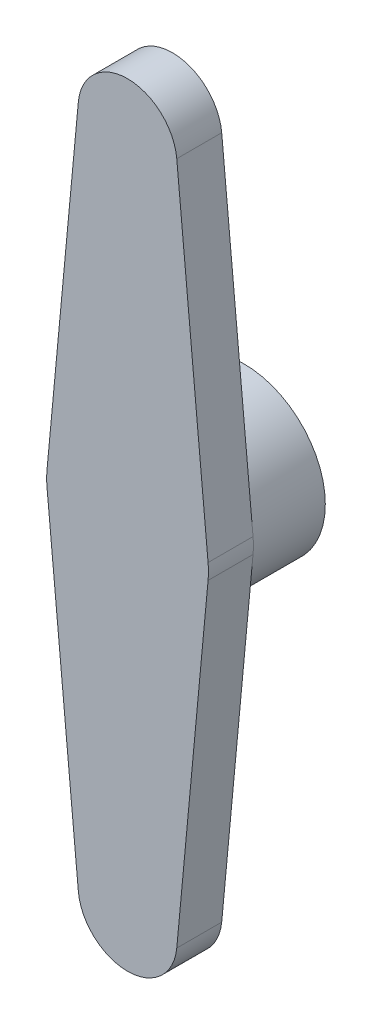
ISO-10303-21;
HEADER;
FILE_DESCRIPTION(('STEP AP214'),'2;1');
FILE_NAME('part.step','',(''),(''),'','','');
FILE_SCHEMA(('AUTOMOTIVE_DESIGN { 1 0 10303 214 1 1 1 1 }'));
ENDSEC;
DATA;
#1=APPLICATION_CONTEXT('core data for automotive mechanical design processes');
#2=APPLICATION_PROTOCOL_DEFINITION('international standard','automotive_design',2000,#1);
#3=PRODUCT_CONTEXT('',#1,'mechanical');
#4=PRODUCT('Part','Part','',(#3));
#5=PRODUCT_RELATED_PRODUCT_CATEGORY('part','',(#4));
#6=PRODUCT_DEFINITION_FORMATION('','',#4);
#7=PRODUCT_DEFINITION_CONTEXT('part definition',#1,'design');
#8=PRODUCT_DEFINITION('design','',#6,#7);
#9=PRODUCT_DEFINITION_SHAPE('','',#8);
#10=(LENGTH_UNIT() NAMED_UNIT(*) SI_UNIT(.MILLI.,.METRE.));
#11=(NAMED_UNIT(*) PLANE_ANGLE_UNIT() SI_UNIT($,.RADIAN.));
#12=(NAMED_UNIT(*) SI_UNIT($,.STERADIAN.) SOLID_ANGLE_UNIT());
#13=UNCERTAINTY_MEASURE_WITH_UNIT(LENGTH_MEASURE(1.E-05),#10,'distance_accuracy_value','');
#14=(GEOMETRIC_REPRESENTATION_CONTEXT(3) GLOBAL_UNCERTAINTY_ASSIGNED_CONTEXT((#13)) GLOBAL_UNIT_ASSIGNED_CONTEXT((#10,
#11,#12)) REPRESENTATION_CONTEXT('',''));
#15=CARTESIAN_POINT('',(0.,0.,0.));
#16=DIRECTION('',(0.,0.,1.));
#17=DIRECTION('',(1.,0.,0.));
#18=AXIS2_PLACEMENT_3D('',#15,#16,#17);
#19=CARTESIAN_POINT('',(0.,0.,9.));
#20=DIRECTION('',(0.,0.,1.));
#21=DIRECTION('',(1.,0.,0.));
#22=AXIS2_PLACEMENT_3D('',#19,#20,#21);
#23=PLANE('',#22);
#24=CARTESIAN_POINT('',(0.,14.999999563202,9.));
#25=DIRECTION('',(0.,0.,1.));
#26=DIRECTION('',(0.995396166005759,0.0958460886058268,0.));
#27=AXIS2_PLACEMENT_3D('',#24,#25,#26);
#28=CIRCLE('',#27,2.200000436798);
#29=CARTESIAN_POINT('',(2.189872,15.210861,9.));
#30=VERTEX_POINT('',#29);
#31=CARTESIAN_POINT('',(-2.189872,15.210861,9.));
#32=VERTEX_POINT('',#31);
#33=EDGE_CURVE('E37',#30,#32,#28,.T.);
#34=ORIENTED_EDGE('',*,*,#33,.F.);
#35=DIRECTION('',(-0.0933329907043877,0.995634949590549,0.));
#36=VECTOR('',#35,1.);
#37=CARTESIAN_POINT('',(3.583426,0.345045,9.));
#38=LINE('',#37,#36);
#39=CARTESIAN_POINT('',(3.583426,0.345045,9.));
#40=VERTEX_POINT('',#39);
#41=EDGE_CURVE('E202',#40,#30,#38,.T.);
#42=ORIENTED_EDGE('',*,*,#41,.F.);
#43=CARTESIAN_POINT('',(0.,0.,9.));
#44=DIRECTION('',(0.,0.,1.));
#45=DIRECTION('',(1.,0.,0.));
#46=AXIS2_PLACEMENT_3D('',#43,#44,#45);
#47=CIRCLE('',#46,3.6);
#48=CARTESIAN_POINT('',(-3.583426,0.345045,9.));
#49=VERTEX_POINT('',#48);
#50=EDGE_CURVE('E200',#40,#49,#47,.T.);
#51=ORIENTED_EDGE('',*,*,#50,.T.);
#52=DIRECTION('',(-0.0933329907043877,-0.995634949590549,0.));
#53=VECTOR('',#52,1.);
#54=CARTESIAN_POINT('',(-2.189872,15.210861,9.));
#55=LINE('',#54,#53);
#56=EDGE_CURVE('E9',#32,#49,#55,.T.);
#57=ORIENTED_EDGE('',*,*,#56,.F.);
#58=EDGE_LOOP('',(#34,#42,#51,#57));
#59=FACE_BOUND('',#58,.T.);
#60=ADVANCED_FACE('F15',(#59),#23,.F.);
#61=CARTESIAN_POINT('',(0.,0.,5.8));
#62=DIRECTION('',(0.,0.,1.));
#63=DIRECTION('',(1.,0.,0.));
#64=AXIS2_PLACEMENT_3D('',#61,#62,#63);
#65=PLANE('',#64);
#66=CARTESIAN_POINT('',(0.,0.,5.8));
#67=DIRECTION('',(0.,0.,1.));
#68=DIRECTION('',(1.,0.,0.));
#69=AXIS2_PLACEMENT_3D('',#66,#67,#68);
#70=CIRCLE('',#69,3.6);
#71=CARTESIAN_POINT('',(3.6,0.,5.8));
#72=VERTEX_POINT('',#71);
#73=EDGE_CURVE('E205',#72,#72,#70,.T.);
#74=ORIENTED_EDGE('',*,*,#73,.F.);
#75=EDGE_LOOP('',(#74));
#76=FACE_BOUND('',#75,.T.);
#77=ADVANCED_FACE('F246',(#76),#65,.F.);
#78=CARTESIAN_POINT('',(-2.189872,15.210861,9.));
#79=DIRECTION('',(0.995634949590549,-0.0933329907043877,0.));
#80=DIRECTION('',(0.,0.,-1.));
#81=AXIS2_PLACEMENT_3D('',#78,#79,#80);
#82=PLANE('',#81);
#83=ORIENTED_EDGE('',*,*,#56,.T.);
#84=DIRECTION('',(0.,0.,1.));
#85=VECTOR('',#84,1.);
#86=CARTESIAN_POINT('',(-3.583426,0.345045,9.));
#87=LINE('',#86,#85);
#88=CARTESIAN_POINT('',(-3.583426,0.345045,11.));
#89=VERTEX_POINT('',#88);
#90=EDGE_CURVE('E181',#49,#89,#87,.T.);
#91=ORIENTED_EDGE('',*,*,#90,.T.);
#92=DIRECTION('',(-0.0933329907043877,-0.995634949590549,0.));
#93=VECTOR('',#92,1.);
#94=CARTESIAN_POINT('',(-2.189872,15.210861,11.));
#95=LINE('',#94,#93);
#96=CARTESIAN_POINT('',(-2.189872,15.210861,11.));
#97=VERTEX_POINT('',#96);
#98=EDGE_CURVE('E144',#97,#89,#95,.T.);
#99=ORIENTED_EDGE('',*,*,#98,.F.);
#100=DIRECTION('',(0.,0.,1.));
#101=VECTOR('',#100,1.);
#102=CARTESIAN_POINT('',(-2.189872,15.210861,9.));
#103=LINE('',#102,#101);
#104=EDGE_CURVE('E23',#32,#97,#103,.T.);
#105=ORIENTED_EDGE('',*,*,#104,.F.);
#106=EDGE_LOOP('',(#83,#91,#99,#105));
#107=FACE_BOUND('',#106,.T.);
#108=ADVANCED_FACE('F222',(#107),#82,.F.);
#109=CARTESIAN_POINT('',(0.,14.999999563202,9.));
#110=DIRECTION('',(0.,0.,-1.));
#111=DIRECTION('',(0.995396166005759,0.0958460886058268,0.));
#112=AXIS2_PLACEMENT_3D('',#109,#110,#111);
#113=CYLINDRICAL_SURFACE('',#112,2.200000436798);
#114=ORIENTED_EDGE('',*,*,#33,.T.);
#115=ORIENTED_EDGE('',*,*,#104,.T.);
#116=CARTESIAN_POINT('',(0.,14.999999563202,11.));
#117=DIRECTION('',(0.,0.,1.));
#118=DIRECTION('',(0.995396166005759,0.0958460886058268,0.));
#119=AXIS2_PLACEMENT_3D('',#116,#117,#118);
#120=CIRCLE('',#119,2.200000436798);
#121=CARTESIAN_POINT('',(2.189872,15.210861,11.));
#122=VERTEX_POINT('',#121);
#123=EDGE_CURVE('E170',#122,#97,#120,.T.);
#124=ORIENTED_EDGE('',*,*,#123,.F.);
#125=DIRECTION('',(0.,0.,1.));
#126=VECTOR('',#125,1.);
#127=CARTESIAN_POINT('',(2.189872,15.210861,9.));
#128=LINE('',#127,#126);
#129=EDGE_CURVE('E207',#30,#122,#128,.T.);
#130=ORIENTED_EDGE('',*,*,#129,.F.);
#131=EDGE_LOOP('',(#114,#115,#124,#130));
#132=FACE_BOUND('',#131,.T.);
#133=ADVANCED_FACE('F217',(#132),#113,.T.);
#134=CARTESIAN_POINT('',(3.583426,0.345045,9.));
#135=DIRECTION('',(-0.995634949590549,-0.0933329907043877,0.));
#136=DIRECTION('',(-0.0933329907043877,0.995634949590549,0.));
#137=AXIS2_PLACEMENT_3D('',#134,#135,#136);
#138=PLANE('',#137);
#139=ORIENTED_EDGE('',*,*,#41,.T.);
#140=ORIENTED_EDGE('',*,*,#129,.T.);
#141=DIRECTION('',(-0.0933329907043877,0.995634949590549,0.));
#142=VECTOR('',#141,1.);
#143=CARTESIAN_POINT('',(3.583426,0.345045,11.));
#144=LINE('',#143,#142);
#145=CARTESIAN_POINT('',(3.583426,0.345045,11.));
#146=VERTEX_POINT('',#145);
#147=EDGE_CURVE('E162',#146,#122,#144,.T.);
#148=ORIENTED_EDGE('',*,*,#147,.F.);
#149=DIRECTION('',(0.,0.,1.));
#150=VECTOR('',#149,1.);
#151=CARTESIAN_POINT('',(3.583426,0.345045,9.));
#152=LINE('',#151,#150);
#153=EDGE_CURVE('E193',#40,#146,#152,.T.);
#154=ORIENTED_EDGE('',*,*,#153,.F.);
#155=EDGE_LOOP('',(#139,#140,#148,#154));
#156=FACE_BOUND('',#155,.T.);
#157=ADVANCED_FACE('F228',(#156),#138,.F.);
#158=CARTESIAN_POINT('',(0.,0.,5.8));
#159=DIRECTION('',(0.,0.,-1.));
#160=DIRECTION('',(1.,0.,0.));
#161=AXIS2_PLACEMENT_3D('',#158,#159,#160);
#162=CYLINDRICAL_SURFACE('',#161,3.6);
#163=DIRECTION('',(0.,0.,1.));
#164=VECTOR('',#163,1.);
#165=CARTESIAN_POINT('',(3.6,0.,5.8));
#166=LINE('',#165,#164);
#167=CARTESIAN_POINT('',(3.6,0.,9.));
#168=VERTEX_POINT('',#167);
#169=EDGE_CURVE('E198',#72,#168,#166,.T.);
#170=ORIENTED_EDGE('',*,*,#169,.T.);
#171=CARTESIAN_POINT('',(6.185890561738E-05,0.,9.));
#172=DIRECTION('',(0.,0.,1.));
#173=DIRECTION('',(0.995396032000994,-0.0958474802833994,0.));
#174=AXIS2_PLACEMENT_3D('',#171,#172,#173);
#175=CIRCLE('',#174,3.599938141094);
#176=CARTESIAN_POINT('',(3.583426,-0.345045,9.));
#177=VERTEX_POINT('',#176);
#178=EDGE_CURVE('E184',#177,#168,#175,.T.);
#179=ORIENTED_EDGE('',*,*,#178,.F.);
#180=CARTESIAN_POINT('',(0.,0.,9.));
#181=DIRECTION('',(0.,0.,1.));
#182=DIRECTION('',(1.,0.,0.));
#183=AXIS2_PLACEMENT_3D('',#180,#181,#182);
#184=CIRCLE('',#183,3.6);
#185=CARTESIAN_POINT('',(-3.583426,-0.345045,9.));
#186=VERTEX_POINT('',#185);
#187=EDGE_CURVE('E151',#186,#177,#184,.T.);
#188=ORIENTED_EDGE('',*,*,#187,.F.);
#189=CARTESIAN_POINT('',(-6.185890561738E-05,0.,9.));
#190=DIRECTION('',(0.,0.,1.));
#191=DIRECTION('',(-0.995396032000994,0.0958474802833994,0.));
#192=AXIS2_PLACEMENT_3D('',#189,#190,#191);
#193=CIRCLE('',#192,3.599938141094);
#194=EDGE_CURVE('E150',#49,#186,#193,.T.);
#195=ORIENTED_EDGE('',*,*,#194,.F.);
#196=ORIENTED_EDGE('',*,*,#50,.F.);
#197=CARTESIAN_POINT('',(6.185890561738E-05,0.,9.));
#198=DIRECTION('',(0.,0.,1.));
#199=DIRECTION('',(0.995396032000994,-0.0958474802833994,0.));
#200=AXIS2_PLACEMENT_3D('',#197,#198,#199);
#201=CIRCLE('',#200,3.599938141094);
#202=EDGE_CURVE('E188',#168,#40,#201,.T.);
#203=ORIENTED_EDGE('',*,*,#202,.F.);
#204=ORIENTED_EDGE('',*,*,#169,.F.);
#205=ORIENTED_EDGE('',*,*,#73,.T.);
#206=EDGE_LOOP('',(#170,#179,#188,#195,#196,#203,#204,#205));
#207=FACE_BOUND('',#206,.T.);
#208=ADVANCED_FACE('F232',(#207),#162,.T.);
#209=CARTESIAN_POINT('',(6.185890561738E-05,0.,9.));
#210=DIRECTION('',(0.,0.,-1.));
#211=DIRECTION('',(0.995396032000994,-0.0958474802833994,0.));
#212=AXIS2_PLACEMENT_3D('',#209,#210,#211);
#213=CYLINDRICAL_SURFACE('',#212,3.599938141094);
#214=ORIENTED_EDGE('',*,*,#178,.T.);
#215=ORIENTED_EDGE('',*,*,#202,.T.);
#216=ORIENTED_EDGE('',*,*,#153,.T.);
#217=CARTESIAN_POINT('',(6.185890561738E-05,0.,11.));
#218=DIRECTION('',(0.,0.,1.));
#219=DIRECTION('',(0.995396032000994,-0.0958474802833994,0.));
#220=AXIS2_PLACEMENT_3D('',#217,#218,#219);
#221=CIRCLE('',#220,3.599938141094);
#222=CARTESIAN_POINT('',(3.583426,-0.345045,11.));
#223=VERTEX_POINT('',#222);
#224=EDGE_CURVE('E152',#223,#146,#221,.T.);
#225=ORIENTED_EDGE('',*,*,#224,.F.);
#226=DIRECTION('',(0.,0.,1.));
#227=VECTOR('',#226,1.);
#228=CARTESIAN_POINT('',(3.583426,-0.345045,9.));
#229=LINE('',#228,#227);
#230=EDGE_CURVE('E159',#177,#223,#229,.T.);
#231=ORIENTED_EDGE('',*,*,#230,.F.);
#232=EDGE_LOOP('',(#214,#215,#216,#225,#231));
#233=FACE_BOUND('',#232,.T.);
#234=ADVANCED_FACE('F242',(#233),#213,.T.);
#235=CARTESIAN_POINT('',(-6.185890561738E-05,0.,9.));
#236=DIRECTION('',(0.,0.,-1.));
#237=DIRECTION('',(-0.995396032000994,0.0958474802833994,0.));
#238=AXIS2_PLACEMENT_3D('',#235,#236,#237);
#239=CYLINDRICAL_SURFACE('',#238,3.599938141094);
#240=ORIENTED_EDGE('',*,*,#194,.T.);
#241=DIRECTION('',(0.,0.,1.));
#242=VECTOR('',#241,1.);
#243=CARTESIAN_POINT('',(-3.583426,-0.345045,9.));
#244=LINE('',#243,#242);
#245=CARTESIAN_POINT('',(-3.583426,-0.345045,11.));
#246=VERTEX_POINT('',#245);
#247=EDGE_CURVE('E113',#186,#246,#244,.T.);
#248=ORIENTED_EDGE('',*,*,#247,.T.);
#249=CARTESIAN_POINT('',(-6.185890561738E-05,0.,11.));
#250=DIRECTION('',(0.,0.,1.));
#251=DIRECTION('',(-0.995396032000994,0.0958474802833994,0.));
#252=AXIS2_PLACEMENT_3D('',#249,#250,#251);
#253=CIRCLE('',#252,3.599938141094);
#254=EDGE_CURVE('E148',#89,#246,#253,.T.);
#255=ORIENTED_EDGE('',*,*,#254,.F.);
#256=ORIENTED_EDGE('',*,*,#90,.F.);
#257=EDGE_LOOP('',(#240,#248,#255,#256));
#258=FACE_BOUND('',#257,.T.);
#259=ADVANCED_FACE('F238',(#258),#239,.T.);
#260=CARTESIAN_POINT('',(0.,0.,11.));
#261=DIRECTION('',(0.,0.,1.));
#262=DIRECTION('',(1.,0.,0.));
#263=AXIS2_PLACEMENT_3D('',#260,#261,#262);
#264=PLANE('',#263);
#265=CARTESIAN_POINT('',(0.,-14.9999995632,11.));
#266=DIRECTION('',(0.,0.,1.));
#267=DIRECTION('',(-0.995396166005759,-0.0958460886058268,0.));
#268=AXIS2_PLACEMENT_3D('',#265,#266,#267);
#269=CIRCLE('',#268,2.200000436798);
#270=CARTESIAN_POINT('',(-2.189872,-15.210861,11.));
#271=VERTEX_POINT('',#270);
#272=CARTESIAN_POINT('',(2.189872,-15.210861,11.));
#273=VERTEX_POINT('',#272);
#274=EDGE_CURVE('E128',#271,#273,#269,.T.);
#275=ORIENTED_EDGE('',*,*,#274,.T.);
#276=DIRECTION('',(0.0933329907043877,0.995634949590549,0.));
#277=VECTOR('',#276,1.);
#278=CARTESIAN_POINT('',(2.189872,-15.210861,11.));
#279=LINE('',#278,#277);
#280=EDGE_CURVE('E154',#273,#223,#279,.T.);
#281=ORIENTED_EDGE('',*,*,#280,.T.);
#282=ORIENTED_EDGE('',*,*,#224,.T.);
#283=ORIENTED_EDGE('',*,*,#147,.T.);
#284=ORIENTED_EDGE('',*,*,#123,.T.);
#285=ORIENTED_EDGE('',*,*,#98,.T.);
#286=ORIENTED_EDGE('',*,*,#254,.T.);
#287=DIRECTION('',(0.0933329907043877,-0.995634949590549,0.));
#288=VECTOR('',#287,1.);
#289=CARTESIAN_POINT('',(-3.583426,-0.345045,11.));
#290=LINE('',#289,#288);
#291=EDGE_CURVE('E120',#246,#271,#290,.T.);
#292=ORIENTED_EDGE('',*,*,#291,.T.);
#293=EDGE_LOOP('',(#275,#281,#282,#283,#284,#285,#286,#292));
#294=FACE_BOUND('',#293,.T.);
#295=ADVANCED_FACE('F223',(#294),#264,.T.);
#296=CARTESIAN_POINT('',(0.,0.,9.));
#297=DIRECTION('',(0.,0.,1.));
#298=DIRECTION('',(1.,0.,0.));
#299=AXIS2_PLACEMENT_3D('',#296,#297,#298);
#300=PLANE('',#299);
#301=ORIENTED_EDGE('',*,*,#187,.T.);
#302=DIRECTION('',(0.0933329907043877,0.995634949590549,0.));
#303=VECTOR('',#302,1.);
#304=CARTESIAN_POINT('',(2.189872,-15.210861,9.));
#305=LINE('',#304,#303);
#306=CARTESIAN_POINT('',(2.189872,-15.210861,9.));
#307=VERTEX_POINT('',#306);
#308=EDGE_CURVE('E132',#307,#177,#305,.T.);
#309=ORIENTED_EDGE('',*,*,#308,.F.);
#310=CARTESIAN_POINT('',(0.,-14.9999995632,9.));
#311=DIRECTION('',(0.,0.,1.));
#312=DIRECTION('',(-0.995396166005759,-0.0958460886058268,0.));
#313=AXIS2_PLACEMENT_3D('',#310,#311,#312);
#314=CIRCLE('',#313,2.200000436798);
#315=CARTESIAN_POINT('',(-2.189872,-15.210861,9.));
#316=VERTEX_POINT('',#315);
#317=EDGE_CURVE('E130',#316,#307,#314,.T.);
#318=ORIENTED_EDGE('',*,*,#317,.F.);
#319=DIRECTION('',(0.0933329907043877,-0.995634949590549,0.));
#320=VECTOR('',#319,1.);
#321=CARTESIAN_POINT('',(-3.583426,-0.345045,9.));
#322=LINE('',#321,#320);
#323=EDGE_CURVE('E107',#186,#316,#322,.T.);
#324=ORIENTED_EDGE('',*,*,#323,.F.);
#325=EDGE_LOOP('',(#301,#309,#318,#324));
#326=FACE_BOUND('',#325,.T.);
#327=ADVANCED_FACE('F131',(#326),#300,.F.);
#328=CARTESIAN_POINT('',(2.189872,-15.210861,9.));
#329=DIRECTION('',(-0.995634949590549,0.0933329907043877,0.));
#330=DIRECTION('',(0.,0.,1.));
#331=AXIS2_PLACEMENT_3D('',#328,#329,#330);
#332=PLANE('',#331);
#333=ORIENTED_EDGE('',*,*,#308,.T.);
#334=ORIENTED_EDGE('',*,*,#230,.T.);
#335=ORIENTED_EDGE('',*,*,#280,.F.);
#336=DIRECTION('',(0.,0.,1.));
#337=VECTOR('',#336,1.);
#338=CARTESIAN_POINT('',(2.189872,-15.210861,9.));
#339=LINE('',#338,#337);
#340=EDGE_CURVE('E136',#307,#273,#339,.T.);
#341=ORIENTED_EDGE('',*,*,#340,.F.);
#342=EDGE_LOOP('',(#333,#334,#335,#341));
#343=FACE_BOUND('',#342,.T.);
#344=ADVANCED_FACE('F239',(#343),#332,.F.);
#345=CARTESIAN_POINT('',(-3.583426,-0.345045,9.));
#346=DIRECTION('',(0.995634949590549,0.0933329907043877,0.));
#347=DIRECTION('',(0.,0.,-1.));
#348=AXIS2_PLACEMENT_3D('',#345,#346,#347);
#349=PLANE('',#348);
#350=ORIENTED_EDGE('',*,*,#323,.T.);
#351=DIRECTION('',(0.,0.,1.));
#352=VECTOR('',#351,1.);
#353=CARTESIAN_POINT('',(-2.189872,-15.210861,9.));
#354=LINE('',#353,#352);
#355=EDGE_CURVE('E115',#316,#271,#354,.T.);
#356=ORIENTED_EDGE('',*,*,#355,.T.);
#357=ORIENTED_EDGE('',*,*,#291,.F.);
#358=ORIENTED_EDGE('',*,*,#247,.F.);
#359=EDGE_LOOP('',(#350,#356,#357,#358));
#360=FACE_BOUND('',#359,.T.);
#361=ADVANCED_FACE('F109',(#360),#349,.F.);
#362=CARTESIAN_POINT('',(0.,-14.9999995632,9.));
#363=DIRECTION('',(0.,0.,-1.));
#364=DIRECTION('',(-0.995396166005759,-0.0958460886058268,0.));
#365=AXIS2_PLACEMENT_3D('',#362,#363,#364);
#366=CYLINDRICAL_SURFACE('',#365,2.200000436798);
#367=ORIENTED_EDGE('',*,*,#317,.T.);
#368=ORIENTED_EDGE('',*,*,#340,.T.);
#369=ORIENTED_EDGE('',*,*,#274,.F.);
#370=ORIENTED_EDGE('',*,*,#355,.F.);
#371=EDGE_LOOP('',(#367,#368,#369,#370));
#372=FACE_BOUND('',#371,.T.);
#373=ADVANCED_FACE('F122',(#372),#366,.T.);
#374=CLOSED_SHELL('',(#60,#77,#108,#133,#157,#208,#234,#259,#295,#327,#344,#361,#373));
#375=MANIFOLD_SOLID_BREP('B1',#374);
#376=ADVANCED_BREP_SHAPE_REPRESENTATION('',(#18,#375),#14);
#377=SHAPE_DEFINITION_REPRESENTATION(#9,#376);
ENDSEC;
END-ISO-10303-21;
